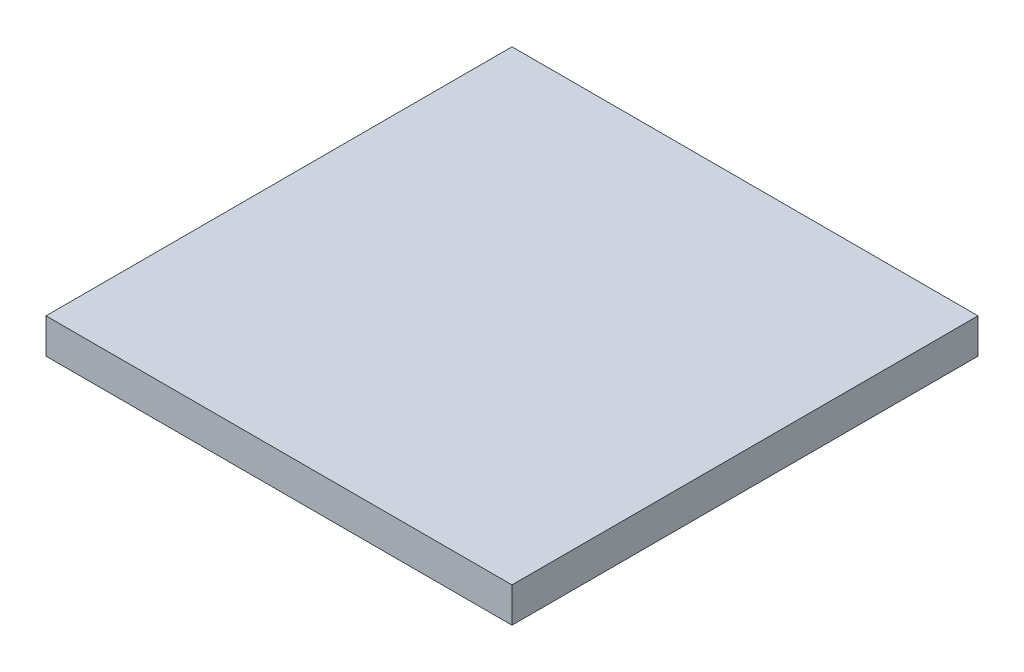
ISO-10303-21;
HEADER;
FILE_DESCRIPTION(('STEP AP214'),'2;1');
FILE_NAME('part.step','',(''),(''),'','','');
FILE_SCHEMA(('AUTOMOTIVE_DESIGN { 1 0 10303 214 1 1 1 1 }'));
ENDSEC;
DATA;
#1=APPLICATION_CONTEXT('core data for automotive mechanical design processes');
#2=APPLICATION_PROTOCOL_DEFINITION('international standard','automotive_design',2000,#1);
#3=PRODUCT_CONTEXT('',#1,'mechanical');
#4=PRODUCT('Part','Part','',(#3));
#5=PRODUCT_RELATED_PRODUCT_CATEGORY('part','',(#4));
#6=PRODUCT_DEFINITION_FORMATION('','',#4);
#7=PRODUCT_DEFINITION_CONTEXT('part definition',#1,'design');
#8=PRODUCT_DEFINITION('design','',#6,#7);
#9=PRODUCT_DEFINITION_SHAPE('','',#8);
#10=(LENGTH_UNIT() NAMED_UNIT(*) SI_UNIT(.MILLI.,.METRE.));
#11=(NAMED_UNIT(*) PLANE_ANGLE_UNIT() SI_UNIT($,.RADIAN.));
#12=(NAMED_UNIT(*) SI_UNIT($,.STERADIAN.) SOLID_ANGLE_UNIT());
#13=UNCERTAINTY_MEASURE_WITH_UNIT(LENGTH_MEASURE(1.E-05),#10,'distance_accuracy_value','');
#14=(GEOMETRIC_REPRESENTATION_CONTEXT(3) GLOBAL_UNCERTAINTY_ASSIGNED_CONTEXT((#13)) GLOBAL_UNIT_ASSIGNED_CONTEXT((#10,
#11,#12)) REPRESENTATION_CONTEXT('',''));
#15=CARTESIAN_POINT('',(0.,0.,0.));
#16=DIRECTION('',(0.,0.,1.));
#17=DIRECTION('',(1.,0.,0.));
#18=AXIS2_PLACEMENT_3D('',#15,#16,#17);
#19=CARTESIAN_POINT('',(0.,7.62,0.));
#20=DIRECTION('',(1.,0.,0.));
#21=DIRECTION('',(0.,0.,-1.));
#22=AXIS2_PLACEMENT_3D('',#19,#20,#21);
#23=PLANE('',#22);
#24=DIRECTION('',(0.,0.,1.));
#25=VECTOR('',#24,1.);
#26=CARTESIAN_POINT('',(0.,0.,0.));
#27=LINE('',#26,#25);
#28=CARTESIAN_POINT('',(0.,0.,0.));
#29=VERTEX_POINT('',#28);
#30=CARTESIAN_POINT('',(0.,0.,101.6));
#31=VERTEX_POINT('',#30);
#32=EDGE_CURVE('E109',#29,#31,#27,.T.);
#33=ORIENTED_EDGE('',*,*,#32,.T.);
#34=DIRECTION('',(0.,-1.,0.));
#35=VECTOR('',#34,1.);
#36=CARTESIAN_POINT('',(0.,7.62,101.6));
#37=LINE('',#36,#35);
#38=CARTESIAN_POINT('',(0.,7.62,101.6));
#39=VERTEX_POINT('',#38);
#40=EDGE_CURVE('E11',#39,#31,#37,.T.);
#41=ORIENTED_EDGE('',*,*,#40,.F.);
#42=DIRECTION('',(0.,0.,1.));
#43=VECTOR('',#42,1.);
#44=CARTESIAN_POINT('',(0.,7.62,0.));
#45=LINE('',#44,#43);
#46=CARTESIAN_POINT('',(0.,7.62,0.));
#47=VERTEX_POINT('',#46);
#48=EDGE_CURVE('E93',#47,#39,#45,.T.);
#49=ORIENTED_EDGE('',*,*,#48,.F.);
#50=DIRECTION('',(0.,-1.,0.));
#51=VECTOR('',#50,1.);
#52=CARTESIAN_POINT('',(0.,7.62,0.));
#53=LINE('',#52,#51);
#54=EDGE_CURVE('E105',#47,#29,#53,.T.);
#55=ORIENTED_EDGE('',*,*,#54,.T.);
#56=EDGE_LOOP('',(#33,#41,#49,#55));
#57=FACE_BOUND('',#56,.T.);
#58=ADVANCED_FACE('F41',(#57),#23,.F.);
#59=CARTESIAN_POINT('',(0.,7.62,101.6));
#60=DIRECTION('',(0.,0.,-1.));
#61=DIRECTION('',(-1.,0.,0.));
#62=AXIS2_PLACEMENT_3D('',#59,#60,#61);
#63=PLANE('',#62);
#64=DIRECTION('',(1.,0.,0.));
#65=VECTOR('',#64,1.);
#66=CARTESIAN_POINT('',(0.,0.,101.6));
#67=LINE('',#66,#65);
#68=CARTESIAN_POINT('',(101.6,0.,101.6));
#69=VERTEX_POINT('',#68);
#70=EDGE_CURVE('E98',#31,#69,#67,.T.);
#71=ORIENTED_EDGE('',*,*,#70,.T.);
#72=DIRECTION('',(0.,-1.,0.));
#73=VECTOR('',#72,1.);
#74=CARTESIAN_POINT('',(101.6,7.62,101.6));
#75=LINE('',#74,#73);
#76=CARTESIAN_POINT('',(101.6,7.62,101.6));
#77=VERTEX_POINT('',#76);
#78=EDGE_CURVE('E50',#77,#69,#75,.T.);
#79=ORIENTED_EDGE('',*,*,#78,.F.);
#80=DIRECTION('',(1.,0.,0.));
#81=VECTOR('',#80,1.);
#82=CARTESIAN_POINT('',(0.,7.62,101.6));
#83=LINE('',#82,#81);
#84=EDGE_CURVE('E88',#39,#77,#83,.T.);
#85=ORIENTED_EDGE('',*,*,#84,.F.);
#86=ORIENTED_EDGE('',*,*,#40,.T.);
#87=EDGE_LOOP('',(#71,#79,#85,#86));
#88=FACE_BOUND('',#87,.T.);
#89=ADVANCED_FACE('F97',(#88),#63,.F.);
#90=CARTESIAN_POINT('',(101.6,7.62,0.));
#91=DIRECTION('',(-1.,0.,0.));
#92=DIRECTION('',(0.,0.,1.));
#93=AXIS2_PLACEMENT_3D('',#90,#91,#92);
#94=PLANE('',#93);
#95=DIRECTION('',(0.,0.,-1.));
#96=VECTOR('',#95,1.);
#97=CARTESIAN_POINT('',(101.6,0.,0.));
#98=LINE('',#97,#96);
#99=CARTESIAN_POINT('',(101.6,0.,0.));
#100=VERTEX_POINT('',#99);
#101=EDGE_CURVE('E75',#69,#100,#98,.T.);
#102=ORIENTED_EDGE('',*,*,#101,.T.);
#103=DIRECTION('',(0.,-1.,0.));
#104=VECTOR('',#103,1.);
#105=CARTESIAN_POINT('',(101.6,7.62,0.));
#106=LINE('',#105,#104);
#107=CARTESIAN_POINT('',(101.6,7.62,0.));
#108=VERTEX_POINT('',#107);
#109=EDGE_CURVE('E100',#108,#100,#106,.T.);
#110=ORIENTED_EDGE('',*,*,#109,.F.);
#111=DIRECTION('',(0.,0.,-1.));
#112=VECTOR('',#111,1.);
#113=CARTESIAN_POINT('',(101.6,7.62,0.));
#114=LINE('',#113,#112);
#115=EDGE_CURVE('E91',#77,#108,#114,.T.);
#116=ORIENTED_EDGE('',*,*,#115,.F.);
#117=ORIENTED_EDGE('',*,*,#78,.T.);
#118=EDGE_LOOP('',(#102,#110,#116,#117));
#119=FACE_BOUND('',#118,.T.);
#120=ADVANCED_FACE('F101',(#119),#94,.F.);
#121=CARTESIAN_POINT('',(0.,7.62,0.));
#122=DIRECTION('',(0.,0.,1.));
#123=DIRECTION('',(1.,0.,0.));
#124=AXIS2_PLACEMENT_3D('',#121,#122,#123);
#125=PLANE('',#124);
#126=DIRECTION('',(-1.,0.,0.));
#127=VECTOR('',#126,1.);
#128=CARTESIAN_POINT('',(0.,0.,0.));
#129=LINE('',#128,#127);
#130=EDGE_CURVE('E81',#100,#29,#129,.T.);
#131=ORIENTED_EDGE('',*,*,#130,.T.);
#132=ORIENTED_EDGE('',*,*,#54,.F.);
#133=DIRECTION('',(-1.,0.,0.));
#134=VECTOR('',#133,1.);
#135=CARTESIAN_POINT('',(0.,7.62,0.));
#136=LINE('',#135,#134);
#137=EDGE_CURVE('E58',#108,#47,#136,.T.);
#138=ORIENTED_EDGE('',*,*,#137,.F.);
#139=ORIENTED_EDGE('',*,*,#109,.T.);
#140=EDGE_LOOP('',(#131,#132,#138,#139));
#141=FACE_BOUND('',#140,.T.);
#142=ADVANCED_FACE('F122',(#141),#125,.F.);
#143=CARTESIAN_POINT('',(0.,7.62,0.));
#144=DIRECTION('',(0.,1.,0.));
#145=DIRECTION('',(0.,0.,1.));
#146=AXIS2_PLACEMENT_3D('',#143,#144,#145);
#147=PLANE('',#146);
#148=ORIENTED_EDGE('',*,*,#48,.T.);
#149=ORIENTED_EDGE('',*,*,#84,.T.);
#150=ORIENTED_EDGE('',*,*,#115,.T.);
#151=ORIENTED_EDGE('',*,*,#137,.T.);
#152=EDGE_LOOP('',(#148,#149,#150,#151));
#153=FACE_BOUND('',#152,.T.);
#154=ADVANCED_FACE('F89',(#153),#147,.T.);
#155=CARTESIAN_POINT('',(0.,0.,0.));
#156=DIRECTION('',(0.,1.,0.));
#157=DIRECTION('',(0.,0.,1.));
#158=AXIS2_PLACEMENT_3D('',#155,#156,#157);
#159=PLANE('',#158);
#160=ORIENTED_EDGE('',*,*,#32,.F.);
#161=ORIENTED_EDGE('',*,*,#130,.F.);
#162=ORIENTED_EDGE('',*,*,#101,.F.);
#163=ORIENTED_EDGE('',*,*,#70,.F.);
#164=EDGE_LOOP('',(#160,#161,#162,#163));
#165=FACE_BOUND('',#164,.T.);
#166=ADVANCED_FACE('F125',(#165),#159,.F.);
#167=CLOSED_SHELL('',(#58,#89,#120,#142,#154,#166));
#168=MANIFOLD_SOLID_BREP('B2',#167);
#169=ADVANCED_BREP_SHAPE_REPRESENTATION('',(#18,#168),#14);
#170=SHAPE_DEFINITION_REPRESENTATION(#9,#169);
ENDSEC;
END-ISO-10303-21;
